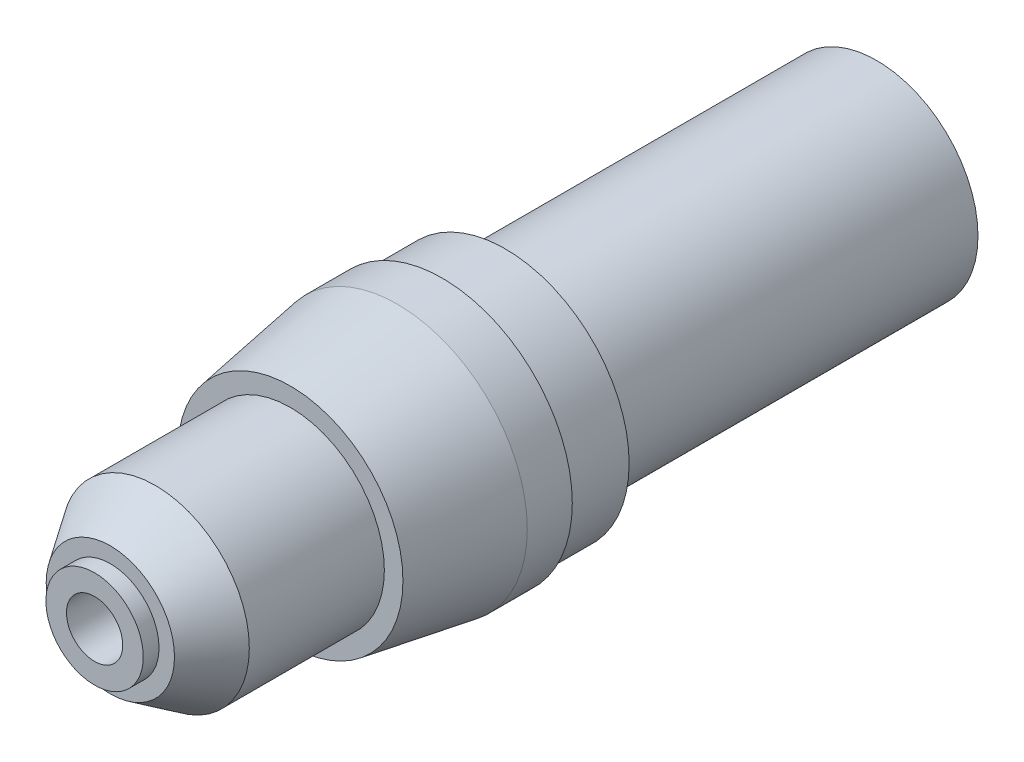
ISO-10303-21;
HEADER;
FILE_DESCRIPTION(('STEP AP214'),'2;1');
FILE_NAME('part.step','',(''),(''),'','','');
FILE_SCHEMA(('AUTOMOTIVE_DESIGN { 1 0 10303 214 1 1 1 1 }'));
ENDSEC;
DATA;
#1=APPLICATION_CONTEXT('core data for automotive mechanical design processes');
#2=APPLICATION_PROTOCOL_DEFINITION('international standard','automotive_design',2000,#1);
#3=PRODUCT_CONTEXT('',#1,'mechanical');
#4=PRODUCT('Part','Part','',(#3));
#5=PRODUCT_RELATED_PRODUCT_CATEGORY('part','',(#4));
#6=PRODUCT_DEFINITION_FORMATION('','',#4);
#7=PRODUCT_DEFINITION_CONTEXT('part definition',#1,'design');
#8=PRODUCT_DEFINITION('design','',#6,#7);
#9=PRODUCT_DEFINITION_SHAPE('','',#8);
#10=(LENGTH_UNIT() NAMED_UNIT(*) SI_UNIT(.MILLI.,.METRE.));
#11=(NAMED_UNIT(*) PLANE_ANGLE_UNIT() SI_UNIT($,.RADIAN.));
#12=(NAMED_UNIT(*) SI_UNIT($,.STERADIAN.) SOLID_ANGLE_UNIT());
#13=UNCERTAINTY_MEASURE_WITH_UNIT(LENGTH_MEASURE(1.E-05),#10,'distance_accuracy_value','');
#14=(GEOMETRIC_REPRESENTATION_CONTEXT(3) GLOBAL_UNCERTAINTY_ASSIGNED_CONTEXT((#13)) GLOBAL_UNIT_ASSIGNED_CONTEXT((#10,
#11,#12)) REPRESENTATION_CONTEXT('',''));
#15=CARTESIAN_POINT('',(0.,0.,0.));
#16=DIRECTION('',(0.,0.,1.));
#17=DIRECTION('',(1.,0.,0.));
#18=AXIS2_PLACEMENT_3D('',#15,#16,#17);
#19=CARTESIAN_POINT('',(0.,0.,83.82));
#20=DIRECTION('',(0.,0.,-1.));
#21=DIRECTION('',(-1.,0.,0.));
#22=AXIS2_PLACEMENT_3D('',#19,#20,#21);
#23=CYLINDRICAL_SURFACE('',#22,22.86);
#24=CARTESIAN_POINT('',(0.,0.,83.82));
#25=DIRECTION('',(0.,0.,1.));
#26=DIRECTION('',(1.,0.,0.));
#27=AXIS2_PLACEMENT_3D('',#24,#25,#26);
#28=CIRCLE('',#27,22.86);
#29=CARTESIAN_POINT('',(22.86,0.,83.82));
#30=VERTEX_POINT('',#29);
#31=EDGE_CURVE('E87',#30,#30,#28,.T.);
#32=ORIENTED_EDGE('',*,*,#31,.F.);
#33=EDGE_LOOP('',(#32));
#34=FACE_BOUND('',#33,.T.);
#35=CARTESIAN_POINT('',(0.,0.,0.));
#36=DIRECTION('',(0.,0.,1.));
#37=DIRECTION('',(1.,0.,0.));
#38=AXIS2_PLACEMENT_3D('',#35,#36,#37);
#39=CIRCLE('',#38,22.86);
#40=CARTESIAN_POINT('',(22.86,0.,0.));
#41=VERTEX_POINT('',#40);
#42=EDGE_CURVE('E46',#41,#41,#39,.T.);
#43=ORIENTED_EDGE('',*,*,#42,.T.);
#44=EDGE_LOOP('',(#43));
#45=FACE_BOUND('',#44,.T.);
#46=ADVANCED_FACE('F43',(#34,#45),#23,.T.);
#47=CARTESIAN_POINT('',(0.,0.,0.));
#48=DIRECTION('',(0.,0.,1.));
#49=DIRECTION('',(1.,0.,0.));
#50=AXIS2_PLACEMENT_3D('',#47,#48,#49);
#51=PLANE('',#50);
#52=CARTESIAN_POINT('',(0.,0.,0.));
#53=DIRECTION('',(0.,0.,-1.));
#54=DIRECTION('',(-1.,0.,0.));
#55=AXIS2_PLACEMENT_3D('',#52,#53,#54);
#56=CIRCLE('',#55,7.493);
#57=CARTESIAN_POINT('',(-7.493,0.,0.));
#58=VERTEX_POINT('',#57);
#59=EDGE_CURVE('E57',#58,#58,#56,.T.);
#60=ORIENTED_EDGE('',*,*,#59,.F.);
#61=EDGE_LOOP('',(#60));
#62=FACE_BOUND('',#61,.T.);
#63=ORIENTED_EDGE('',*,*,#42,.F.);
#64=EDGE_LOOP('',(#63));
#65=FACE_BOUND('',#64,.T.);
#66=ADVANCED_FACE('F103',(#62,#65),#51,.F.);
#67=CARTESIAN_POINT('',(0.,0.,98.044));
#68=DIRECTION('',(0.,0.,-1.));
#69=DIRECTION('',(-1.,0.,0.));
#70=AXIS2_PLACEMENT_3D('',#67,#68,#69);
#71=CYLINDRICAL_SURFACE('',#70,27.94);
#72=CARTESIAN_POINT('',(0.,0.,98.044));
#73=DIRECTION('',(0.,0.,1.));
#74=DIRECTION('',(1.,0.,0.));
#75=AXIS2_PLACEMENT_3D('',#72,#73,#74);
#76=CIRCLE('',#75,27.94);
#77=CARTESIAN_POINT('',(27.94,0.,98.044));
#78=VERTEX_POINT('',#77);
#79=EDGE_CURVE('E88',#78,#78,#76,.T.);
#80=ORIENTED_EDGE('',*,*,#79,.F.);
#81=EDGE_LOOP('',(#80));
#82=FACE_BOUND('',#81,.T.);
#83=CARTESIAN_POINT('',(0.,0.,83.82));
#84=DIRECTION('',(0.,0.,1.));
#85=DIRECTION('',(1.,0.,0.));
#86=AXIS2_PLACEMENT_3D('',#83,#84,#85);
#87=CIRCLE('',#86,27.94);
#88=CARTESIAN_POINT('',(27.94,0.,83.82));
#89=VERTEX_POINT('',#88);
#90=EDGE_CURVE('E83',#89,#89,#87,.T.);
#91=ORIENTED_EDGE('',*,*,#90,.T.);
#92=EDGE_LOOP('',(#91));
#93=FACE_BOUND('',#92,.T.);
#94=ADVANCED_FACE('F105',(#82,#93),#71,.T.);
#95=CARTESIAN_POINT('',(0.,0.,83.82));
#96=DIRECTION('',(0.,0.,1.));
#97=DIRECTION('',(1.,0.,0.));
#98=AXIS2_PLACEMENT_3D('',#95,#96,#97);
#99=PLANE('',#98);
#100=ORIENTED_EDGE('',*,*,#31,.T.);
#101=EDGE_LOOP('',(#100));
#102=FACE_BOUND('',#101,.T.);
#103=ORIENTED_EDGE('',*,*,#90,.F.);
#104=EDGE_LOOP('',(#103));
#105=FACE_BOUND('',#104,.T.);
#106=ADVANCED_FACE('F111',(#102,#105),#99,.F.);
#107=CARTESIAN_POINT('',(0.,0.,-4.445));
#108=DIRECTION('',(0.,0.,1.));
#109=DIRECTION('',(1.,0.,0.));
#110=AXIS2_PLACEMENT_3D('',#107,#108,#109);
#111=CYLINDRICAL_SURFACE('',#110,7.493);
#112=CARTESIAN_POINT('',(0.,0.,-4.445));
#113=DIRECTION('',(0.,0.,-1.));
#114=DIRECTION('',(-1.,0.,0.));
#115=AXIS2_PLACEMENT_3D('',#112,#113,#114);
#116=CIRCLE('',#115,7.493);
#117=CARTESIAN_POINT('',(-7.493,0.,-4.445));
#118=VERTEX_POINT('',#117);
#119=EDGE_CURVE('E76',#118,#118,#116,.T.);
#120=ORIENTED_EDGE('',*,*,#119,.F.);
#121=EDGE_LOOP('',(#120));
#122=FACE_BOUND('',#121,.T.);
#123=ORIENTED_EDGE('',*,*,#59,.T.);
#124=EDGE_LOOP('',(#123));
#125=FACE_BOUND('',#124,.T.);
#126=ADVANCED_FACE('F119',(#122,#125),#111,.T.);
#127=CARTESIAN_POINT('',(0.,0.,-4.445));
#128=DIRECTION('',(0.,0.,-1.));
#129=DIRECTION('',(-1.,0.,0.));
#130=AXIS2_PLACEMENT_3D('',#127,#128,#129);
#131=PLANE('',#130);
#132=ORIENTED_EDGE('',*,*,#119,.T.);
#133=EDGE_LOOP('',(#132));
#134=FACE_BOUND('',#133,.T.);
#135=ADVANCED_FACE('F122',(#134),#131,.T.);
#136=CARTESIAN_POINT('',(0.,0.,108.204));
#137=DIRECTION('',(0.,0.,-1.));
#138=DIRECTION('',(-1.,0.,0.));
#139=AXIS2_PLACEMENT_3D('',#136,#137,#138);
#140=CYLINDRICAL_SURFACE('',#139,29.337);
#141=CARTESIAN_POINT('',(0.,0.,108.204));
#142=DIRECTION('',(0.,0.,1.));
#143=DIRECTION('',(1.,0.,0.));
#144=AXIS2_PLACEMENT_3D('',#141,#142,#143);
#145=CIRCLE('',#144,29.337);
#146=CARTESIAN_POINT('',(29.337,0.,108.204));
#147=VERTEX_POINT('',#146);
#148=EDGE_CURVE('E72',#147,#147,#145,.T.);
#149=ORIENTED_EDGE('',*,*,#148,.F.);
#150=EDGE_LOOP('',(#149));
#151=FACE_BOUND('',#150,.T.);
#152=CARTESIAN_POINT('',(0.,0.,98.044));
#153=DIRECTION('',(0.,0.,1.));
#154=DIRECTION('',(1.,0.,0.));
#155=AXIS2_PLACEMENT_3D('',#152,#153,#154);
#156=CIRCLE('',#155,29.337);
#157=CARTESIAN_POINT('',(29.337,0.,98.044));
#158=VERTEX_POINT('',#157);
#159=EDGE_CURVE('E71',#158,#158,#156,.T.);
#160=ORIENTED_EDGE('',*,*,#159,.T.);
#161=EDGE_LOOP('',(#160));
#162=FACE_BOUND('',#161,.T.);
#163=ADVANCED_FACE('F126',(#151,#162),#140,.T.);
#164=CARTESIAN_POINT('',(0.,0.,98.044));
#165=DIRECTION('',(0.,0.,1.));
#166=DIRECTION('',(1.,0.,0.));
#167=AXIS2_PLACEMENT_3D('',#164,#165,#166);
#168=PLANE('',#167);
#169=ORIENTED_EDGE('',*,*,#79,.T.);
#170=EDGE_LOOP('',(#169));
#171=FACE_BOUND('',#170,.T.);
#172=ORIENTED_EDGE('',*,*,#159,.F.);
#173=EDGE_LOOP('',(#172));
#174=FACE_BOUND('',#173,.T.);
#175=ADVANCED_FACE('F130',(#171,#174),#168,.F.);
#176=CARTESIAN_POINT('',(0.,0.,132.334));
#177=DIRECTION('',(0.,0.,-1.));
#178=DIRECTION('',(-1.,0.,0.));
#179=AXIS2_PLACEMENT_3D('',#176,#177,#178);
#180=CONICAL_SURFACE('',#179,25.4,0.161732806840395);
#181=ORIENTED_EDGE('',*,*,#148,.T.);
#182=EDGE_LOOP('',(#181));
#183=FACE_BOUND('',#182,.T.);
#184=CARTESIAN_POINT('',(0.,0.,132.334));
#185=DIRECTION('',(0.,0.,1.));
#186=DIRECTION('',(1.,0.,0.));
#187=AXIS2_PLACEMENT_3D('',#184,#185,#186);
#188=CIRCLE('',#187,25.4);
#189=CARTESIAN_POINT('',(25.4,0.,132.334));
#190=VERTEX_POINT('',#189);
#191=EDGE_CURVE('E66',#190,#190,#188,.T.);
#192=ORIENTED_EDGE('',*,*,#191,.F.);
#193=EDGE_LOOP('',(#192));
#194=FACE_BOUND('',#193,.T.);
#195=ADVANCED_FACE('F134',(#183,#194),#180,.T.);
#196=CARTESIAN_POINT('',(0.,0.,132.334));
#197=DIRECTION('',(0.,0.,1.));
#198=DIRECTION('',(1.,0.,0.));
#199=AXIS2_PLACEMENT_3D('',#196,#197,#198);
#200=PLANE('',#199);
#201=CARTESIAN_POINT('',(0.,0.,132.334));
#202=DIRECTION('',(0.,0.,1.));
#203=DIRECTION('',(1.,0.,0.));
#204=AXIS2_PLACEMENT_3D('',#201,#202,#203);
#205=CIRCLE('',#204,21.209);
#206=CARTESIAN_POINT('',(-21.209,0.,132.334));
#207=VERTEX_POINT('',#206);
#208=EDGE_CURVE('E51',#207,#207,#205,.T.);
#209=ORIENTED_EDGE('',*,*,#208,.F.);
#210=EDGE_LOOP('',(#209));
#211=FACE_BOUND('',#210,.T.);
#212=ORIENTED_EDGE('',*,*,#191,.T.);
#213=EDGE_LOOP('',(#212));
#214=FACE_BOUND('',#213,.T.);
#215=ADVANCED_FACE('F136',(#211,#214),#200,.T.);
#216=CARTESIAN_POINT('',(0.,0.,162.814));
#217=DIRECTION('',(0.,0.,-1.));
#218=DIRECTION('',(-1.,0.,0.));
#219=AXIS2_PLACEMENT_3D('',#216,#217,#218);
#220=CYLINDRICAL_SURFACE('',#219,21.209);
#221=CARTESIAN_POINT('',(0.,0.,162.814));
#222=DIRECTION('',(0.,0.,1.));
#223=DIRECTION('',(1.,0.,0.));
#224=AXIS2_PLACEMENT_3D('',#221,#222,#223);
#225=CIRCLE('',#224,21.209);
#226=CARTESIAN_POINT('',(-21.209,0.,162.814));
#227=VERTEX_POINT('',#226);
#228=EDGE_CURVE('E63',#227,#227,#225,.T.);
#229=CARTESIAN_POINT('',(-21.209,0.,162.814));
#230=CARTESIAN_POINT('',(-21.209,0.,162.4965));
#231=CARTESIAN_POINT('',(-21.209,0.,162.179));
#232=CARTESIAN_POINT('',(-21.209,0.,161.544));
#233=CARTESIAN_POINT('',(-21.209,0.,161.2265));
#234=CARTESIAN_POINT('',(-21.209,0.,160.5915));
#235=CARTESIAN_POINT('',(-21.209,0.,160.274));
#236=CARTESIAN_POINT('',(-21.209,0.,159.639));
#237=CARTESIAN_POINT('',(-21.209,0.,159.3215));
#238=CARTESIAN_POINT('',(-21.209,0.,158.6865));
#239=CARTESIAN_POINT('',(-21.209,0.,158.369));
#240=CARTESIAN_POINT('',(-21.209,0.,157.734));
#241=CARTESIAN_POINT('',(-21.209,0.,157.4165));
#242=CARTESIAN_POINT('',(-21.209,0.,156.7815));
#243=CARTESIAN_POINT('',(-21.209,0.,156.464));
#244=CARTESIAN_POINT('',(-21.209,0.,155.829));
#245=CARTESIAN_POINT('',(-21.209,0.,155.5115));
#246=CARTESIAN_POINT('',(-21.209,0.,154.8765));
#247=CARTESIAN_POINT('',(-21.209,0.,154.559));
#248=CARTESIAN_POINT('',(-21.209,0.,153.924));
#249=CARTESIAN_POINT('',(-21.209,0.,153.6065));
#250=CARTESIAN_POINT('',(-21.209,0.,152.9715));
#251=CARTESIAN_POINT('',(-21.209,0.,152.654));
#252=CARTESIAN_POINT('',(-21.209,0.,152.019));
#253=CARTESIAN_POINT('',(-21.209,0.,151.7015));
#254=CARTESIAN_POINT('',(-21.209,0.,151.0665));
#255=CARTESIAN_POINT('',(-21.209,0.,150.749));
#256=CARTESIAN_POINT('',(-21.209,0.,150.114));
#257=CARTESIAN_POINT('',(-21.209,0.,149.7965));
#258=CARTESIAN_POINT('',(-21.209,0.,149.1615));
#259=CARTESIAN_POINT('',(-21.209,0.,148.844));
#260=CARTESIAN_POINT('',(-21.209,0.,148.209));
#261=CARTESIAN_POINT('',(-21.209,0.,147.8915));
#262=CARTESIAN_POINT('',(-21.209,0.,147.2565));
#263=CARTESIAN_POINT('',(-21.209,0.,146.939));
#264=CARTESIAN_POINT('',(-21.209,0.,146.304));
#265=CARTESIAN_POINT('',(-21.209,0.,145.9865));
#266=CARTESIAN_POINT('',(-21.209,0.,145.3515));
#267=CARTESIAN_POINT('',(-21.209,0.,145.034));
#268=CARTESIAN_POINT('',(-21.209,0.,144.399));
#269=CARTESIAN_POINT('',(-21.209,0.,144.0815));
#270=CARTESIAN_POINT('',(-21.209,0.,143.4465));
#271=CARTESIAN_POINT('',(-21.209,0.,143.129));
#272=CARTESIAN_POINT('',(-21.209,0.,142.494));
#273=CARTESIAN_POINT('',(-21.209,0.,142.1765));
#274=CARTESIAN_POINT('',(-21.209,0.,141.5415));
#275=CARTESIAN_POINT('',(-21.209,0.,141.224));
#276=CARTESIAN_POINT('',(-21.209,0.,140.589));
#277=CARTESIAN_POINT('',(-21.209,0.,140.2715));
#278=CARTESIAN_POINT('',(-21.209,0.,139.6365));
#279=CARTESIAN_POINT('',(-21.209,0.,139.319));
#280=CARTESIAN_POINT('',(-21.209,0.,138.684));
#281=CARTESIAN_POINT('',(-21.209,0.,138.3665));
#282=CARTESIAN_POINT('',(-21.209,0.,137.7315));
#283=CARTESIAN_POINT('',(-21.209,0.,137.414));
#284=CARTESIAN_POINT('',(-21.209,0.,136.779));
#285=CARTESIAN_POINT('',(-21.209,0.,136.4615));
#286=CARTESIAN_POINT('',(-21.209,0.,135.8265));
#287=CARTESIAN_POINT('',(-21.209,0.,135.509));
#288=CARTESIAN_POINT('',(-21.209,0.,134.874));
#289=CARTESIAN_POINT('',(-21.209,0.,134.5565));
#290=CARTESIAN_POINT('',(-21.209,0.,133.9215));
#291=CARTESIAN_POINT('',(-21.209,0.,133.604));
#292=CARTESIAN_POINT('',(-21.209,0.,132.969));
#293=CARTESIAN_POINT('',(-21.209,0.,132.6515));
#294=CARTESIAN_POINT('',(-21.209,0.,132.334));
#295=B_SPLINE_CURVE_WITH_KNOTS('',3,(#229,#230,#231,#232,#233,#234,#235,#236,#237,#238,#239,
#240,#241,#242,#243,#244,#245,#246,#247,#248,#249,#250,#251,#252,#253,#254,#255,#256,#257,#258,
#259,#260,#261,#262,#263,#264,#265,#266,#267,#268,#269,#270,#271,#272,#273,#274,#275,#276,#277,
#278,#279,#280,#281,#282,#283,#284,#285,#286,#287,#288,#289,#290,#291,#292,#293,#294),
.UNSPECIFIED.,.F.,.F.,(4,2,2,2,2,2,2,2,2,2,2,2,2,2,2,2,2,2,2,2,2,2,2,2,2,2,2,2,2,2,2,2,4),(0.,
0.952499999999995,1.90499999999999,2.85749999999998,3.80999999999998,4.76249999999998,5.715,
6.66749999999999,7.61999999999999,8.57249999999998,9.52499999999998,10.4775,11.43,12.3825,
13.335,14.2875,15.24,16.1925,17.145,18.0975,19.05,20.0025,20.955,21.9075,22.86,23.8125,24.765,
25.7175,26.67,27.6225,28.575,29.5275,30.48),.UNSPECIFIED.);
#296=EDGE_CURVE('BSEAM139',#227,#207,#295,.T.);
#297=ORIENTED_EDGE('',*,*,#228,.F.);
#298=ORIENTED_EDGE('',*,*,#208,.T.);
#299=ORIENTED_EDGE('',*,*,#296,.T.);
#300=ORIENTED_EDGE('',*,*,#296,.F.);
#301=EDGE_LOOP('',(#297,#299,#298,#300));
#302=FACE_BOUND('',#301,.T.);
#303=ADVANCED_FACE('F139',(#302),#220,.T.);
#304=CARTESIAN_POINT('',(0.,0.,172.974));
#305=DIRECTION('',(0.,0.,-1.));
#306=DIRECTION('',(-1.,0.,0.));
#307=AXIS2_PLACEMENT_3D('',#304,#305,#306);
#308=CONICAL_SURFACE('',#307,14.478,0.585112438184427);
#309=ORIENTED_EDGE('',*,*,#228,.T.);
#310=EDGE_LOOP('',(#309));
#311=FACE_BOUND('',#310,.T.);
#312=CARTESIAN_POINT('',(0.,0.,172.974));
#313=DIRECTION('',(0.,0.,1.));
#314=DIRECTION('',(1.,0.,0.));
#315=AXIS2_PLACEMENT_3D('',#312,#313,#314);
#316=CIRCLE('',#315,14.478);
#317=CARTESIAN_POINT('',(14.478,0.,172.974));
#318=VERTEX_POINT('',#317);
#319=EDGE_CURVE('E176',#318,#318,#316,.T.);
#320=ORIENTED_EDGE('',*,*,#319,.F.);
#321=EDGE_LOOP('',(#320));
#322=FACE_BOUND('',#321,.T.);
#323=ADVANCED_FACE('F146',(#311,#322),#308,.T.);
#324=CARTESIAN_POINT('',(0.,0.,176.53));
#325=DIRECTION('',(0.,0.,1.));
#326=DIRECTION('',(1.,0.,0.));
#327=AXIS2_PLACEMENT_3D('',#324,#325,#326);
#328=PLANE('',#327);
#329=CARTESIAN_POINT('',(0.,0.,176.53));
#330=DIRECTION('',(0.,0.,1.));
#331=DIRECTION('',(1.,0.,0.));
#332=AXIS2_PLACEMENT_3D('',#329,#330,#331);
#333=CIRCLE('',#332,6.35);
#334=CARTESIAN_POINT('',(6.35,0.,176.53));
#335=VERTEX_POINT('',#334);
#336=EDGE_CURVE('E177',#335,#335,#333,.T.);
#337=ORIENTED_EDGE('',*,*,#336,.F.);
#338=EDGE_LOOP('',(#337));
#339=FACE_BOUND('',#338,.T.);
#340=CARTESIAN_POINT('',(0.,0.,176.53));
#341=DIRECTION('',(0.,0.,1.));
#342=DIRECTION('',(1.,0.,0.));
#343=AXIS2_PLACEMENT_3D('',#340,#341,#342);
#344=CIRCLE('',#343,10.9855);
#345=CARTESIAN_POINT('',(10.9855,0.,176.53));
#346=VERTEX_POINT('',#345);
#347=EDGE_CURVE('E61',#346,#346,#344,.T.);
#348=ORIENTED_EDGE('',*,*,#347,.T.);
#349=EDGE_LOOP('',(#348));
#350=FACE_BOUND('',#349,.T.);
#351=ADVANCED_FACE('F156',(#339,#350),#328,.T.);
#352=CARTESIAN_POINT('',(0.,0.,176.53));
#353=DIRECTION('',(0.,0.,-1.));
#354=DIRECTION('',(-1.,0.,0.));
#355=AXIS2_PLACEMENT_3D('',#352,#353,#354);
#356=CYLINDRICAL_SURFACE('',#355,10.9855);
#357=ORIENTED_EDGE('',*,*,#347,.F.);
#358=EDGE_LOOP('',(#357));
#359=FACE_BOUND('',#358,.T.);
#360=CARTESIAN_POINT('',(0.,0.,172.974));
#361=DIRECTION('',(0.,0.,1.));
#362=DIRECTION('',(1.,0.,0.));
#363=AXIS2_PLACEMENT_3D('',#360,#361,#362);
#364=CIRCLE('',#363,10.9855);
#365=CARTESIAN_POINT('',(10.9855,0.,172.974));
#366=VERTEX_POINT('',#365);
#367=EDGE_CURVE('E11',#366,#366,#364,.T.);
#368=ORIENTED_EDGE('',*,*,#367,.T.);
#369=EDGE_LOOP('',(#368));
#370=FACE_BOUND('',#369,.T.);
#371=ADVANCED_FACE('F152',(#359,#370),#356,.T.);
#372=CARTESIAN_POINT('',(0.,0.,172.974));
#373=DIRECTION('',(0.,0.,1.));
#374=DIRECTION('',(1.,0.,0.));
#375=AXIS2_PLACEMENT_3D('',#372,#373,#374);
#376=PLANE('',#375);
#377=ORIENTED_EDGE('',*,*,#367,.F.);
#378=EDGE_LOOP('',(#377));
#379=FACE_BOUND('',#378,.T.);
#380=ORIENTED_EDGE('',*,*,#319,.T.);
#381=EDGE_LOOP('',(#380));
#382=FACE_BOUND('',#381,.T.);
#383=ADVANCED_FACE('F148',(#379,#382),#376,.T.);
#384=CARTESIAN_POINT('',(0.,0.,151.13));
#385=DIRECTION('',(0.,0.,1.));
#386=DIRECTION('',(1.,0.,0.));
#387=AXIS2_PLACEMENT_3D('',#384,#385,#386);
#388=CYLINDRICAL_SURFACE('',#387,6.35);
#389=CARTESIAN_POINT('',(0.,0.,151.13));
#390=DIRECTION('',(0.,0.,1.));
#391=DIRECTION('',(1.,0.,0.));
#392=AXIS2_PLACEMENT_3D('',#389,#390,#391);
#393=CIRCLE('',#392,6.35);
#394=CARTESIAN_POINT('',(6.35,0.,151.13));
#395=VERTEX_POINT('',#394);
#396=EDGE_CURVE('E174',#395,#395,#393,.T.);
#397=ORIENTED_EDGE('',*,*,#396,.F.);
#398=EDGE_LOOP('',(#397));
#399=FACE_BOUND('',#398,.T.);
#400=ORIENTED_EDGE('',*,*,#336,.T.);
#401=EDGE_LOOP('',(#400));
#402=FACE_BOUND('',#401,.T.);
#403=ADVANCED_FACE('F151',(#399,#402),#388,.F.);
#404=CARTESIAN_POINT('',(0.,0.,151.13));
#405=DIRECTION('',(0.,0.,1.));
#406=DIRECTION('',(1.,0.,0.));
#407=AXIS2_PLACEMENT_3D('',#404,#405,#406);
#408=PLANE('',#407);
#409=ORIENTED_EDGE('',*,*,#396,.T.);
#410=EDGE_LOOP('',(#409));
#411=FACE_BOUND('',#410,.T.);
#412=ADVANCED_FACE('F166',(#411),#408,.T.);
#413=CLOSED_SHELL('',(#46,#66,#94,#106,#126,#135,#163,#175,#195,#215,#303,#323,#351,#371,#383,
#403,#412));
#414=MANIFOLD_SOLID_BREP('B2',#413);
#415=ADVANCED_BREP_SHAPE_REPRESENTATION('',(#18,#414),#14);
#416=SHAPE_DEFINITION_REPRESENTATION(#9,#415);
ENDSEC;
END-ISO-10303-21;
